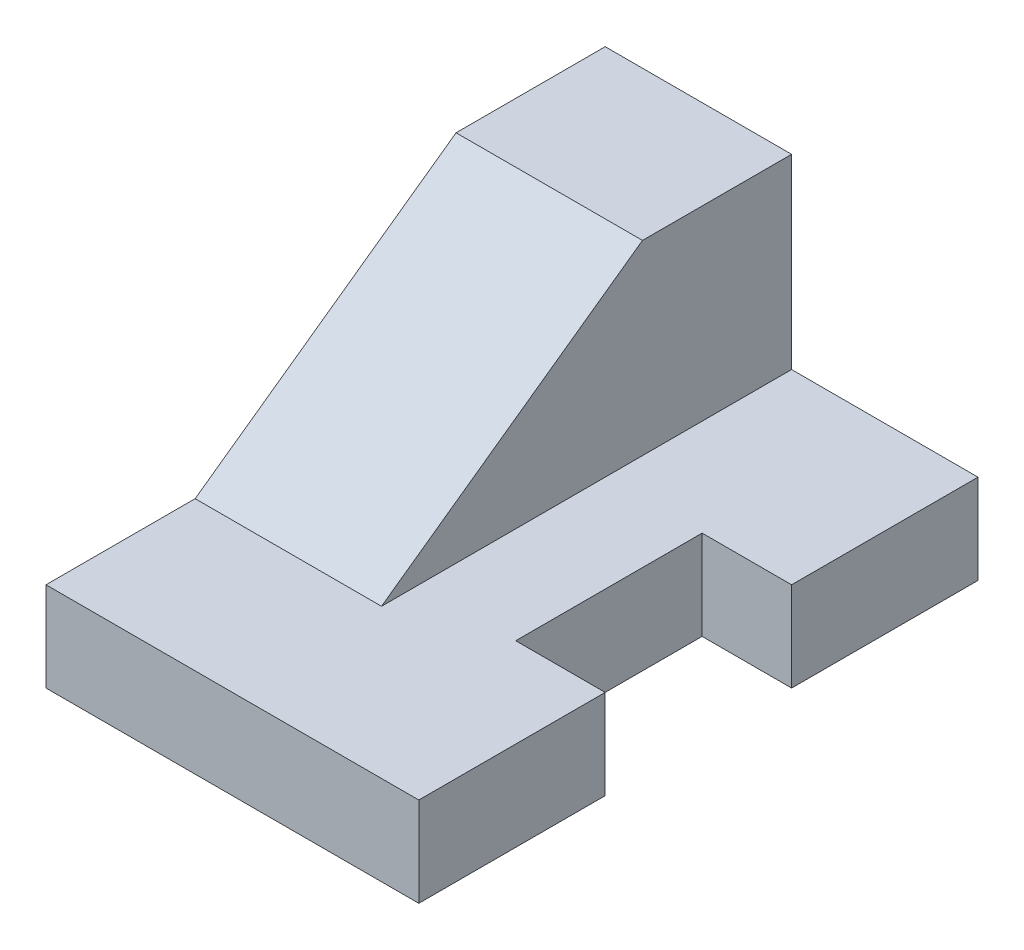
ISO-10303-21;
HEADER;
FILE_DESCRIPTION(('STEP AP214'),'2;1');
FILE_NAME('part.step','',(''),(''),'','','');
FILE_SCHEMA(('AUTOMOTIVE_DESIGN { 1 0 10303 214 1 1 1 1 }'));
ENDSEC;
DATA;
#1=APPLICATION_CONTEXT('core data for automotive mechanical design processes');
#2=APPLICATION_PROTOCOL_DEFINITION('international standard','automotive_design',2000,#1);
#3=PRODUCT_CONTEXT('',#1,'mechanical');
#4=PRODUCT('Part','Part','',(#3));
#5=PRODUCT_RELATED_PRODUCT_CATEGORY('part','',(#4));
#6=PRODUCT_DEFINITION_FORMATION('','',#4);
#7=PRODUCT_DEFINITION_CONTEXT('part definition',#1,'design');
#8=PRODUCT_DEFINITION('design','',#6,#7);
#9=PRODUCT_DEFINITION_SHAPE('','',#8);
#10=(LENGTH_UNIT() NAMED_UNIT(*) SI_UNIT(.MILLI.,.METRE.));
#11=(NAMED_UNIT(*) PLANE_ANGLE_UNIT() SI_UNIT($,.RADIAN.));
#12=(NAMED_UNIT(*) SI_UNIT($,.STERADIAN.) SOLID_ANGLE_UNIT());
#13=UNCERTAINTY_MEASURE_WITH_UNIT(LENGTH_MEASURE(1.E-05),#10,'distance_accuracy_value','');
#14=(GEOMETRIC_REPRESENTATION_CONTEXT(3) GLOBAL_UNCERTAINTY_ASSIGNED_CONTEXT((#13)) GLOBAL_UNIT_ASSIGNED_CONTEXT((#10,
#11,#12)) REPRESENTATION_CONTEXT('',''));
#15=CARTESIAN_POINT('',(0.,0.,0.));
#16=DIRECTION('',(0.,0.,1.));
#17=DIRECTION('',(1.,0.,0.));
#18=AXIS2_PLACEMENT_3D('',#15,#16,#17);
#19=CARTESIAN_POINT('',(50.,0.,50.));
#20=DIRECTION('',(0.,0.,-1.));
#21=DIRECTION('',(-1.,0.,0.));
#22=AXIS2_PLACEMENT_3D('',#19,#20,#21);
#23=PLANE('',#22);
#24=DIRECTION('',(0.,-1.,0.));
#25=VECTOR('',#24,1.);
#26=CARTESIAN_POINT('',(38.,0.,50.));
#27=LINE('',#26,#25);
#28=CARTESIAN_POINT('',(38.,12.,50.));
#29=VERTEX_POINT('',#28);
#30=CARTESIAN_POINT('',(38.,0.,50.));
#31=VERTEX_POINT('',#30);
#32=EDGE_CURVE('E57',#29,#31,#27,.T.);
#33=ORIENTED_EDGE('',*,*,#32,.F.);
#34=DIRECTION('',(-1.,0.,0.));
#35=VECTOR('',#34,1.);
#36=CARTESIAN_POINT('',(50.,12.,50.));
#37=LINE('',#36,#35);
#38=CARTESIAN_POINT('',(50.,12.,50.));
#39=VERTEX_POINT('',#38);
#40=EDGE_CURVE('E11',#39,#29,#37,.T.);
#41=ORIENTED_EDGE('',*,*,#40,.F.);
#42=DIRECTION('',(0.,-1.,0.));
#43=VECTOR('',#42,1.);
#44=CARTESIAN_POINT('',(50.,0.,50.));
#45=LINE('',#44,#43);
#46=CARTESIAN_POINT('',(50.,0.,50.));
#47=VERTEX_POINT('',#46);
#48=EDGE_CURVE('E184',#39,#47,#45,.T.);
#49=ORIENTED_EDGE('',*,*,#48,.T.);
#50=DIRECTION('',(-1.,0.,0.));
#51=VECTOR('',#50,1.);
#52=CARTESIAN_POINT('',(50.,0.,50.));
#53=LINE('',#52,#51);
#54=EDGE_CURVE('E197',#47,#31,#53,.T.);
#55=ORIENTED_EDGE('',*,*,#54,.T.);
#56=EDGE_LOOP('',(#33,#41,#49,#55));
#57=FACE_BOUND('',#56,.T.);
#58=ADVANCED_FACE('F35',(#57),#23,.T.);
#59=CARTESIAN_POINT('',(50.,12.,0.));
#60=DIRECTION('',(0.,1.,0.));
#61=DIRECTION('',(0.,0.,1.));
#62=AXIS2_PLACEMENT_3D('',#59,#60,#61);
#63=PLANE('',#62);
#64=DIRECTION('',(0.,0.,-1.));
#65=VECTOR('',#64,1.);
#66=CARTESIAN_POINT('',(25.,12.,0.));
#67=LINE('',#66,#65);
#68=CARTESIAN_POINT('',(25.,12.,55.));
#69=VERTEX_POINT('',#68);
#70=CARTESIAN_POINT('',(25.,12.,0.));
#71=VERTEX_POINT('',#70);
#72=EDGE_CURVE('E137',#69,#71,#67,.T.);
#73=ORIENTED_EDGE('',*,*,#72,.F.);
#74=DIRECTION('',(-1.,0.,0.));
#75=VECTOR('',#74,1.);
#76=CARTESIAN_POINT('',(25.,12.,55.));
#77=LINE('',#76,#75);
#78=CARTESIAN_POINT('',(0.,12.,55.));
#79=VERTEX_POINT('',#78);
#80=EDGE_CURVE('E145',#69,#79,#77,.T.);
#81=ORIENTED_EDGE('',*,*,#80,.T.);
#82=DIRECTION('',(0.,0.,-1.));
#83=VECTOR('',#82,1.);
#84=CARTESIAN_POINT('',(0.,12.,0.));
#85=LINE('',#84,#83);
#86=CARTESIAN_POINT('',(0.,12.,75.));
#87=VERTEX_POINT('',#86);
#88=EDGE_CURVE('E183',#87,#79,#85,.T.);
#89=ORIENTED_EDGE('',*,*,#88,.F.);
#90=DIRECTION('',(-1.,0.,0.));
#91=VECTOR('',#90,1.);
#92=CARTESIAN_POINT('',(50.,12.,75.));
#93=LINE('',#92,#91);
#94=CARTESIAN_POINT('',(50.,12.,75.));
#95=VERTEX_POINT('',#94);
#96=EDGE_CURVE('E42',#95,#87,#93,.T.);
#97=ORIENTED_EDGE('',*,*,#96,.F.);
#98=DIRECTION('',(0.,0.,-1.));
#99=VECTOR('',#98,1.);
#100=CARTESIAN_POINT('',(50.,12.,0.));
#101=LINE('',#100,#99);
#102=EDGE_CURVE('E187',#95,#39,#101,.T.);
#103=ORIENTED_EDGE('',*,*,#102,.T.);
#104=ORIENTED_EDGE('',*,*,#40,.T.);
#105=DIRECTION('',(0.,0.,-1.));
#106=VECTOR('',#105,1.);
#107=CARTESIAN_POINT('',(38.,12.,0.));
#108=LINE('',#107,#106);
#109=CARTESIAN_POINT('',(38.,12.,25.));
#110=VERTEX_POINT('',#109);
#111=EDGE_CURVE('E179',#29,#110,#108,.T.);
#112=ORIENTED_EDGE('',*,*,#111,.T.);
#113=DIRECTION('',(-1.,0.,0.));
#114=VECTOR('',#113,1.);
#115=CARTESIAN_POINT('',(50.,12.,25.));
#116=LINE('',#115,#114);
#117=CARTESIAN_POINT('',(50.,12.,25.));
#118=VERTEX_POINT('',#117);
#119=EDGE_CURVE('E163',#118,#110,#116,.T.);
#120=ORIENTED_EDGE('',*,*,#119,.F.);
#121=DIRECTION('',(0.,0.,-1.));
#122=VECTOR('',#121,1.);
#123=CARTESIAN_POINT('',(50.,12.,0.));
#124=LINE('',#123,#122);
#125=CARTESIAN_POINT('',(50.,12.,0.));
#126=VERTEX_POINT('',#125);
#127=EDGE_CURVE('E160',#118,#126,#124,.T.);
#128=ORIENTED_EDGE('',*,*,#127,.T.);
#129=DIRECTION('',(-1.,0.,0.));
#130=VECTOR('',#129,1.);
#131=CARTESIAN_POINT('',(50.,12.,0.));
#132=LINE('',#131,#130);
#133=EDGE_CURVE('E166',#126,#71,#132,.T.);
#134=ORIENTED_EDGE('',*,*,#133,.T.);
#135=EDGE_LOOP('',(#73,#81,#89,#97,#103,#104,#112,#120,#128,#134));
#136=FACE_BOUND('',#135,.T.);
#137=ADVANCED_FACE('F214',(#136),#63,.T.);
#138=CARTESIAN_POINT('',(50.,0.,75.));
#139=DIRECTION('',(0.,0.,1.));
#140=DIRECTION('',(0.,-1.,0.));
#141=AXIS2_PLACEMENT_3D('',#138,#139,#140);
#142=PLANE('',#141);
#143=DIRECTION('',(0.,1.,0.));
#144=VECTOR('',#143,1.);
#145=CARTESIAN_POINT('',(0.,0.,75.));
#146=LINE('',#145,#144);
#147=CARTESIAN_POINT('',(0.,0.,75.));
#148=VERTEX_POINT('',#147);
#149=EDGE_CURVE('E200',#148,#87,#146,.T.);
#150=ORIENTED_EDGE('',*,*,#149,.F.);
#151=DIRECTION('',(-1.,0.,0.));
#152=VECTOR('',#151,1.);
#153=CARTESIAN_POINT('',(50.,0.,75.));
#154=LINE('',#153,#152);
#155=CARTESIAN_POINT('',(50.,0.,75.));
#156=VERTEX_POINT('',#155);
#157=EDGE_CURVE('E206',#156,#148,#154,.T.);
#158=ORIENTED_EDGE('',*,*,#157,.F.);
#159=DIRECTION('',(0.,1.,0.));
#160=VECTOR('',#159,1.);
#161=CARTESIAN_POINT('',(50.,0.,75.));
#162=LINE('',#161,#160);
#163=EDGE_CURVE('E191',#156,#95,#162,.T.);
#164=ORIENTED_EDGE('',*,*,#163,.T.);
#165=ORIENTED_EDGE('',*,*,#96,.T.);
#166=EDGE_LOOP('',(#150,#158,#164,#165));
#167=FACE_BOUND('',#166,.T.);
#168=ADVANCED_FACE('F210',(#167),#142,.T.);
#169=CARTESIAN_POINT('',(50.,0.,0.));
#170=DIRECTION('',(0.,-1.,0.));
#171=DIRECTION('',(0.,0.,-1.));
#172=AXIS2_PLACEMENT_3D('',#169,#170,#171);
#173=PLANE('',#172);
#174=DIRECTION('',(0.,0.,1.));
#175=VECTOR('',#174,1.);
#176=CARTESIAN_POINT('',(0.,0.,0.));
#177=LINE('',#176,#175);
#178=CARTESIAN_POINT('',(0.,0.,0.));
#179=VERTEX_POINT('',#178);
#180=EDGE_CURVE('E188',#179,#148,#177,.T.);
#181=ORIENTED_EDGE('',*,*,#180,.F.);
#182=DIRECTION('',(-1.,0.,0.));
#183=VECTOR('',#182,1.);
#184=CARTESIAN_POINT('',(50.,0.,0.));
#185=LINE('',#184,#183);
#186=CARTESIAN_POINT('',(50.,0.,0.));
#187=VERTEX_POINT('',#186);
#188=EDGE_CURVE('E168',#187,#179,#185,.T.);
#189=ORIENTED_EDGE('',*,*,#188,.F.);
#190=DIRECTION('',(0.,0.,1.));
#191=VECTOR('',#190,1.);
#192=CARTESIAN_POINT('',(50.,0.,0.));
#193=LINE('',#192,#191);
#194=CARTESIAN_POINT('',(50.,0.,25.));
#195=VERTEX_POINT('',#194);
#196=EDGE_CURVE('E154',#187,#195,#193,.T.);
#197=ORIENTED_EDGE('',*,*,#196,.T.);
#198=DIRECTION('',(-1.,0.,0.));
#199=VECTOR('',#198,1.);
#200=CARTESIAN_POINT('',(50.,0.,25.));
#201=LINE('',#200,#199);
#202=CARTESIAN_POINT('',(38.,0.,25.));
#203=VERTEX_POINT('',#202);
#204=EDGE_CURVE('E170',#195,#203,#201,.T.);
#205=ORIENTED_EDGE('',*,*,#204,.T.);
#206=DIRECTION('',(0.,0.,1.));
#207=VECTOR('',#206,1.);
#208=CARTESIAN_POINT('',(38.,0.,0.));
#209=LINE('',#208,#207);
#210=EDGE_CURVE('E173',#203,#31,#209,.T.);
#211=ORIENTED_EDGE('',*,*,#210,.T.);
#212=ORIENTED_EDGE('',*,*,#54,.F.);
#213=DIRECTION('',(0.,0.,1.));
#214=VECTOR('',#213,1.);
#215=CARTESIAN_POINT('',(50.,0.,0.));
#216=LINE('',#215,#214);
#217=EDGE_CURVE('E194',#47,#156,#216,.T.);
#218=ORIENTED_EDGE('',*,*,#217,.T.);
#219=ORIENTED_EDGE('',*,*,#157,.T.);
#220=EDGE_LOOP('',(#181,#189,#197,#205,#211,#212,#218,#219));
#221=FACE_BOUND('',#220,.T.);
#222=ADVANCED_FACE('F218',(#221),#173,.T.);
#223=CARTESIAN_POINT('',(50.,0.,0.));
#224=DIRECTION('',(1.,0.,0.));
#225=DIRECTION('',(0.,0.,-1.));
#226=AXIS2_PLACEMENT_3D('',#223,#224,#225);
#227=PLANE('',#226);
#228=ORIENTED_EDGE('',*,*,#48,.F.);
#229=ORIENTED_EDGE('',*,*,#102,.F.);
#230=ORIENTED_EDGE('',*,*,#163,.F.);
#231=ORIENTED_EDGE('',*,*,#217,.F.);
#232=EDGE_LOOP('',(#228,#229,#230,#231));
#233=FACE_BOUND('',#232,.T.);
#234=ADVANCED_FACE('F238',(#233),#227,.T.);
#235=CARTESIAN_POINT('',(0.,0.,0.));
#236=DIRECTION('',(1.,0.,0.));
#237=DIRECTION('',(0.,0.,-1.));
#238=AXIS2_PLACEMENT_3D('',#235,#236,#237);
#239=PLANE('',#238);
#240=ORIENTED_EDGE('',*,*,#88,.T.);
#241=DIRECTION('',(0.,0.581238193719097,-0.813733471206735));
#242=VECTOR('',#241,1.);
#243=CARTESIAN_POINT('',(0.,33.9594594594595,24.2567567567568));
#244=LINE('',#243,#242);
#245=CARTESIAN_POINT('',(0.,37.,20.));
#246=VERTEX_POINT('',#245);
#247=EDGE_CURVE('E49',#79,#246,#244,.T.);
#248=ORIENTED_EDGE('',*,*,#247,.T.);
#249=DIRECTION('',(0.,0.,-1.));
#250=VECTOR('',#249,1.);
#251=CARTESIAN_POINT('',(0.,37.,0.));
#252=LINE('',#251,#250);
#253=CARTESIAN_POINT('',(0.,37.,0.));
#254=VERTEX_POINT('',#253);
#255=EDGE_CURVE('E146',#246,#254,#252,.T.);
#256=ORIENTED_EDGE('',*,*,#255,.T.);
#257=DIRECTION('',(0.,-1.,0.));
#258=VECTOR('',#257,1.);
#259=CARTESIAN_POINT('',(0.,0.,0.));
#260=LINE('',#259,#258);
#261=EDGE_CURVE('E123',#254,#179,#260,.T.);
#262=ORIENTED_EDGE('',*,*,#261,.T.);
#263=ORIENTED_EDGE('',*,*,#180,.T.);
#264=ORIENTED_EDGE('',*,*,#149,.T.);
#265=EDGE_LOOP('',(#240,#248,#256,#262,#263,#264));
#266=FACE_BOUND('',#265,.T.);
#267=ADVANCED_FACE('F216',(#266),#239,.F.);
#268=CARTESIAN_POINT('',(38.,0.,0.));
#269=DIRECTION('',(1.,0.,0.));
#270=DIRECTION('',(0.,0.,-1.));
#271=AXIS2_PLACEMENT_3D('',#268,#269,#270);
#272=PLANE('',#271);
#273=ORIENTED_EDGE('',*,*,#210,.F.);
#274=DIRECTION('',(0.,1.,0.));
#275=VECTOR('',#274,1.);
#276=CARTESIAN_POINT('',(38.,0.,25.));
#277=LINE('',#276,#275);
#278=EDGE_CURVE('E176',#203,#110,#277,.T.);
#279=ORIENTED_EDGE('',*,*,#278,.T.);
#280=ORIENTED_EDGE('',*,*,#111,.F.);
#281=ORIENTED_EDGE('',*,*,#32,.T.);
#282=EDGE_LOOP('',(#273,#279,#280,#281));
#283=FACE_BOUND('',#282,.T.);
#284=ADVANCED_FACE('F230',(#283),#272,.T.);
#285=CARTESIAN_POINT('',(50.,0.,25.));
#286=DIRECTION('',(0.,0.,1.));
#287=DIRECTION('',(1.,0.,0.));
#288=AXIS2_PLACEMENT_3D('',#285,#286,#287);
#289=PLANE('',#288);
#290=ORIENTED_EDGE('',*,*,#278,.F.);
#291=ORIENTED_EDGE('',*,*,#204,.F.);
#292=DIRECTION('',(0.,1.,0.));
#293=VECTOR('',#292,1.);
#294=CARTESIAN_POINT('',(50.,0.,25.));
#295=LINE('',#294,#293);
#296=EDGE_CURVE('E151',#195,#118,#295,.T.);
#297=ORIENTED_EDGE('',*,*,#296,.T.);
#298=ORIENTED_EDGE('',*,*,#119,.T.);
#299=EDGE_LOOP('',(#290,#291,#297,#298));
#300=FACE_BOUND('',#299,.T.);
#301=ADVANCED_FACE('F227',(#300),#289,.T.);
#302=CARTESIAN_POINT('',(50.,0.,0.));
#303=DIRECTION('',(0.,0.,-1.));
#304=DIRECTION('',(0.,1.,0.));
#305=AXIS2_PLACEMENT_3D('',#302,#303,#304);
#306=PLANE('',#305);
#307=ORIENTED_EDGE('',*,*,#261,.F.);
#308=DIRECTION('',(-1.,0.,0.));
#309=VECTOR('',#308,1.);
#310=CARTESIAN_POINT('',(25.,37.,0.));
#311=LINE('',#310,#309);
#312=CARTESIAN_POINT('',(25.,37.,0.));
#313=VERTEX_POINT('',#312);
#314=EDGE_CURVE('E116',#313,#254,#311,.T.);
#315=ORIENTED_EDGE('',*,*,#314,.F.);
#316=DIRECTION('',(0.,-1.,0.));
#317=VECTOR('',#316,1.);
#318=CARTESIAN_POINT('',(25.,0.,0.));
#319=LINE('',#318,#317);
#320=EDGE_CURVE('E119',#313,#71,#319,.T.);
#321=ORIENTED_EDGE('',*,*,#320,.T.);
#322=ORIENTED_EDGE('',*,*,#133,.F.);
#323=DIRECTION('',(0.,-1.,0.));
#324=VECTOR('',#323,1.);
#325=CARTESIAN_POINT('',(50.,0.,0.));
#326=LINE('',#325,#324);
#327=EDGE_CURVE('E157',#126,#187,#326,.T.);
#328=ORIENTED_EDGE('',*,*,#327,.T.);
#329=ORIENTED_EDGE('',*,*,#188,.T.);
#330=EDGE_LOOP('',(#307,#315,#321,#322,#328,#329));
#331=FACE_BOUND('',#330,.T.);
#332=ADVANCED_FACE('F118',(#331),#306,.T.);
#333=CARTESIAN_POINT('',(50.,0.,0.));
#334=DIRECTION('',(1.,0.,0.));
#335=DIRECTION('',(0.,0.,-1.));
#336=AXIS2_PLACEMENT_3D('',#333,#334,#335);
#337=PLANE('',#336);
#338=ORIENTED_EDGE('',*,*,#296,.F.);
#339=ORIENTED_EDGE('',*,*,#196,.F.);
#340=ORIENTED_EDGE('',*,*,#327,.F.);
#341=ORIENTED_EDGE('',*,*,#127,.F.);
#342=EDGE_LOOP('',(#338,#339,#340,#341));
#343=FACE_BOUND('',#342,.T.);
#344=ADVANCED_FACE('F224',(#343),#337,.T.);
#345=CARTESIAN_POINT('',(25.,37.,0.));
#346=DIRECTION('',(0.,1.,0.));
#347=DIRECTION('',(0.,0.,1.));
#348=AXIS2_PLACEMENT_3D('',#345,#346,#347);
#349=PLANE('',#348);
#350=ORIENTED_EDGE('',*,*,#255,.F.);
#351=DIRECTION('',(-1.,0.,0.));
#352=VECTOR('',#351,1.);
#353=CARTESIAN_POINT('',(25.,37.,20.));
#354=LINE('',#353,#352);
#355=CARTESIAN_POINT('',(25.,37.,20.));
#356=VERTEX_POINT('',#355);
#357=EDGE_CURVE('E128',#356,#246,#354,.T.);
#358=ORIENTED_EDGE('',*,*,#357,.F.);
#359=DIRECTION('',(0.,0.,-1.));
#360=VECTOR('',#359,1.);
#361=CARTESIAN_POINT('',(25.,37.,0.));
#362=LINE('',#361,#360);
#363=EDGE_CURVE('E134',#356,#313,#362,.T.);
#364=ORIENTED_EDGE('',*,*,#363,.T.);
#365=ORIENTED_EDGE('',*,*,#314,.T.);
#366=EDGE_LOOP('',(#350,#358,#364,#365));
#367=FACE_BOUND('',#366,.T.);
#368=ADVANCED_FACE('F139',(#367),#349,.T.);
#369=CARTESIAN_POINT('',(25.,33.9594594594595,24.2567567567568));
#370=DIRECTION('',(0.,0.813733471206735,0.581238193719097));
#371=DIRECTION('',(0.,-0.581238193719097,0.813733471206735));
#372=AXIS2_PLACEMENT_3D('',#369,#370,#371);
#373=PLANE('',#372);
#374=ORIENTED_EDGE('',*,*,#247,.F.);
#375=ORIENTED_EDGE('',*,*,#80,.F.);
#376=DIRECTION('',(0.,0.581238193719097,-0.813733471206735));
#377=VECTOR('',#376,1.);
#378=CARTESIAN_POINT('',(25.,33.9594594594595,24.2567567567568));
#379=LINE('',#378,#377);
#380=EDGE_CURVE('E140',#69,#356,#379,.T.);
#381=ORIENTED_EDGE('',*,*,#380,.T.);
#382=ORIENTED_EDGE('',*,*,#357,.T.);
#383=EDGE_LOOP('',(#374,#375,#381,#382));
#384=FACE_BOUND('',#383,.T.);
#385=ADVANCED_FACE('F289',(#384),#373,.T.);
#386=CARTESIAN_POINT('',(25.,0.,0.));
#387=DIRECTION('',(1.,0.,0.));
#388=DIRECTION('',(0.,0.,-1.));
#389=AXIS2_PLACEMENT_3D('',#386,#387,#388);
#390=PLANE('',#389);
#391=ORIENTED_EDGE('',*,*,#320,.F.);
#392=ORIENTED_EDGE('',*,*,#363,.F.);
#393=ORIENTED_EDGE('',*,*,#380,.F.);
#394=ORIENTED_EDGE('',*,*,#72,.T.);
#395=EDGE_LOOP('',(#391,#392,#393,#394));
#396=FACE_BOUND('',#395,.T.);
#397=ADVANCED_FACE('F132',(#396),#390,.T.);
#398=CLOSED_SHELL('',(#58,#137,#168,#222,#234,#267,#284,#301,#332,#344,#368,#385,#397));
#399=MANIFOLD_SOLID_BREP('B2',#398);
#400=ADVANCED_BREP_SHAPE_REPRESENTATION('',(#18,#399),#14);
#401=SHAPE_DEFINITION_REPRESENTATION(#9,#400);
ENDSEC;
END-ISO-10303-21;
